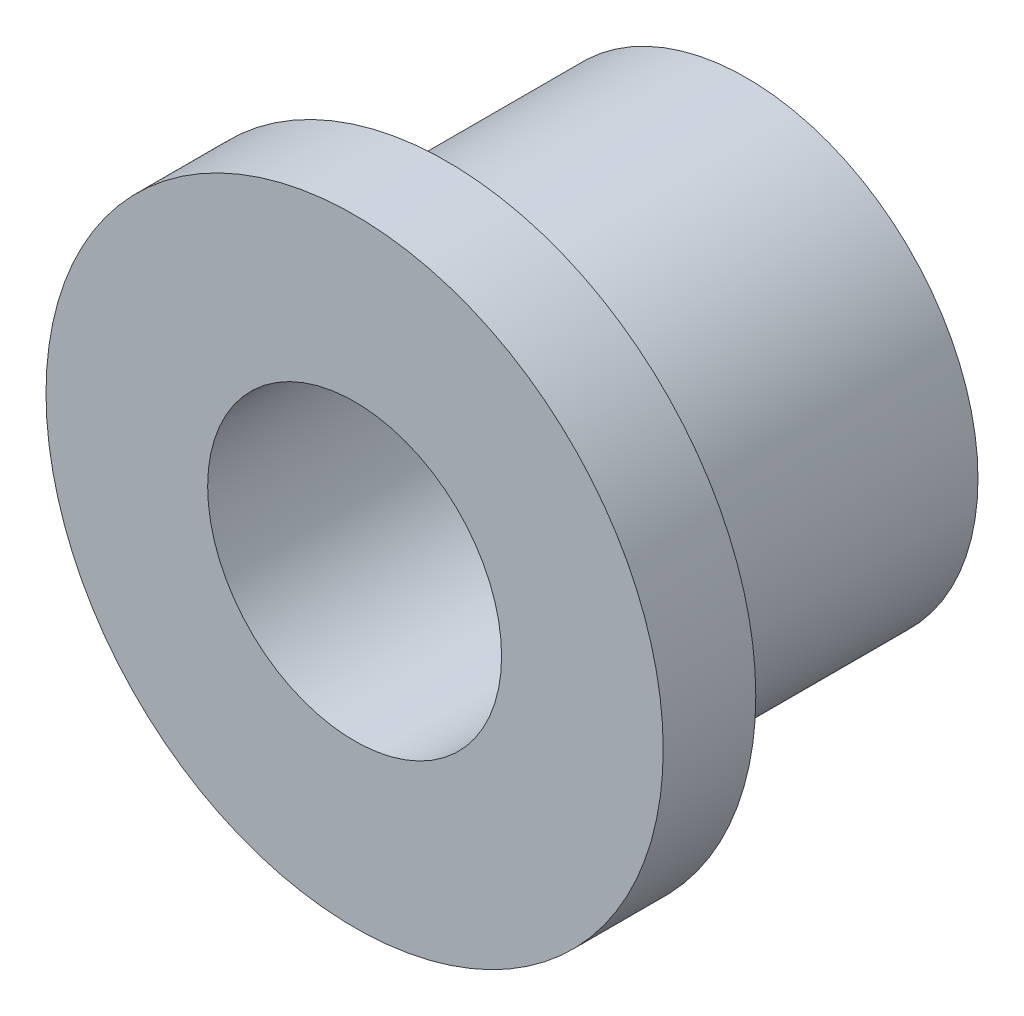
ISO-10303-21;
HEADER;
FILE_DESCRIPTION(('STEP AP214'),'2;1');
FILE_NAME('part.step','',(''),(''),'','','');
FILE_SCHEMA(('AUTOMOTIVE_DESIGN { 1 0 10303 214 1 1 1 1 }'));
ENDSEC;
DATA;
#1=APPLICATION_CONTEXT('core data for automotive mechanical design processes');
#2=APPLICATION_PROTOCOL_DEFINITION('international standard','automotive_design',2000,#1);
#3=PRODUCT_CONTEXT('',#1,'mechanical');
#4=PRODUCT('Part','Part','',(#3));
#5=PRODUCT_RELATED_PRODUCT_CATEGORY('part','',(#4));
#6=PRODUCT_DEFINITION_FORMATION('','',#4);
#7=PRODUCT_DEFINITION_CONTEXT('part definition',#1,'design');
#8=PRODUCT_DEFINITION('design','',#6,#7);
#9=PRODUCT_DEFINITION_SHAPE('','',#8);
#10=(LENGTH_UNIT() NAMED_UNIT(*) SI_UNIT(.MILLI.,.METRE.));
#11=(NAMED_UNIT(*) PLANE_ANGLE_UNIT() SI_UNIT($,.RADIAN.));
#12=(NAMED_UNIT(*) SI_UNIT($,.STERADIAN.) SOLID_ANGLE_UNIT());
#13=UNCERTAINTY_MEASURE_WITH_UNIT(LENGTH_MEASURE(1.E-05),#10,'distance_accuracy_value','');
#14=(GEOMETRIC_REPRESENTATION_CONTEXT(3) GLOBAL_UNCERTAINTY_ASSIGNED_CONTEXT((#13)) GLOBAL_UNIT_ASSIGNED_CONTEXT((#10,
#11,#12)) REPRESENTATION_CONTEXT('',''));
#15=CARTESIAN_POINT('',(0.,0.,0.));
#16=DIRECTION('',(0.,0.,1.));
#17=DIRECTION('',(1.,0.,0.));
#18=AXIS2_PLACEMENT_3D('',#15,#16,#17);
#19=CARTESIAN_POINT('',(0.,0.,6.35));
#20=DIRECTION('',(0.,0.,-1.));
#21=DIRECTION('',(-1.,0.,0.));
#22=AXIS2_PLACEMENT_3D('',#19,#20,#21);
#23=CYLINDRICAL_SURFACE('',#22,7.5);
#24=CARTESIAN_POINT('',(0.,0.,-6.35));
#25=DIRECTION('',(0.,0.,1.));
#26=DIRECTION('',(1.,0.,0.));
#27=AXIS2_PLACEMENT_3D('',#24,#25,#26);
#28=CIRCLE('',#27,7.5);
#29=CARTESIAN_POINT('',(7.5,0.,-6.35));
#30=VERTEX_POINT('',#29);
#31=EDGE_CURVE('E34',#30,#30,#28,.T.);
#32=ORIENTED_EDGE('',*,*,#31,.T.);
#33=EDGE_LOOP('',(#32));
#34=FACE_BOUND('',#33,.T.);
#35=CARTESIAN_POINT('',(0.,0.,3.35));
#36=DIRECTION('',(0.,0.,1.));
#37=DIRECTION('',(1.,0.,0.));
#38=AXIS2_PLACEMENT_3D('',#35,#36,#37);
#39=CIRCLE('',#38,7.5);
#40=CARTESIAN_POINT('',(7.5,0.,3.35));
#41=VERTEX_POINT('',#40);
#42=EDGE_CURVE('E10',#41,#41,#39,.T.);
#43=ORIENTED_EDGE('',*,*,#42,.F.);
#44=EDGE_LOOP('',(#43));
#45=FACE_BOUND('',#44,.T.);
#46=ADVANCED_FACE('F31',(#34,#45),#23,.T.);
#47=CARTESIAN_POINT('',(0.,0.,6.35));
#48=DIRECTION('',(0.,0.,1.));
#49=DIRECTION('',(1.,0.,0.));
#50=AXIS2_PLACEMENT_3D('',#47,#48,#49);
#51=PLANE('',#50);
#52=CARTESIAN_POINT('',(0.,0.,6.35));
#53=DIRECTION('',(0.,0.,1.));
#54=DIRECTION('',(1.,0.,0.));
#55=AXIS2_PLACEMENT_3D('',#52,#53,#54);
#56=CIRCLE('',#55,4.7625);
#57=CARTESIAN_POINT('',(4.7625,0.,6.35));
#58=VERTEX_POINT('',#57);
#59=EDGE_CURVE('E47',#58,#58,#56,.T.);
#60=ORIENTED_EDGE('',*,*,#59,.F.);
#61=EDGE_LOOP('',(#60));
#62=FACE_BOUND('',#61,.T.);
#63=CARTESIAN_POINT('',(0.,0.,6.35));
#64=DIRECTION('',(0.,0.,1.));
#65=DIRECTION('',(1.,0.,0.));
#66=AXIS2_PLACEMENT_3D('',#63,#64,#65);
#67=CIRCLE('',#66,10.);
#68=CARTESIAN_POINT('',(10.,0.,6.35));
#69=VERTEX_POINT('',#68);
#70=EDGE_CURVE('E45',#69,#69,#67,.T.);
#71=ORIENTED_EDGE('',*,*,#70,.T.);
#72=EDGE_LOOP('',(#71));
#73=FACE_BOUND('',#72,.T.);
#74=ADVANCED_FACE('F58',(#62,#73),#51,.T.);
#75=CARTESIAN_POINT('',(0.,0.,-6.35));
#76=DIRECTION('',(0.,0.,1.));
#77=DIRECTION('',(1.,0.,0.));
#78=AXIS2_PLACEMENT_3D('',#75,#76,#77);
#79=PLANE('',#78);
#80=CARTESIAN_POINT('',(0.,0.,-6.35));
#81=DIRECTION('',(0.,0.,1.));
#82=DIRECTION('',(1.,0.,0.));
#83=AXIS2_PLACEMENT_3D('',#80,#81,#82);
#84=CIRCLE('',#83,4.7625);
#85=CARTESIAN_POINT('',(4.7625,0.,-6.35));
#86=VERTEX_POINT('',#85);
#87=EDGE_CURVE('E42',#86,#86,#84,.F.);
#88=ORIENTED_EDGE('',*,*,#87,.F.);
#89=EDGE_LOOP('',(#88));
#90=FACE_BOUND('',#89,.T.);
#91=ORIENTED_EDGE('',*,*,#31,.F.);
#92=EDGE_LOOP('',(#91));
#93=FACE_BOUND('',#92,.T.);
#94=ADVANCED_FACE('F55',(#90,#93),#79,.F.);
#95=CARTESIAN_POINT('',(0.,0.,-19.8203841816037));
#96=DIRECTION('',(0.,0.,1.));
#97=DIRECTION('',(1.,0.,0.));
#98=AXIS2_PLACEMENT_3D('',#95,#96,#97);
#99=CYLINDRICAL_SURFACE('',#98,4.7625);
#100=ORIENTED_EDGE('',*,*,#59,.T.);
#101=EDGE_LOOP('',(#100));
#102=FACE_BOUND('',#101,.T.);
#103=ORIENTED_EDGE('',*,*,#87,.T.);
#104=EDGE_LOOP('',(#103));
#105=FACE_BOUND('',#104,.T.);
#106=ADVANCED_FACE('F53',(#102,#105),#99,.F.);
#107=CARTESIAN_POINT('',(0.,0.,3.35));
#108=DIRECTION('',(0.,0.,1.));
#109=DIRECTION('',(1.,0.,0.));
#110=AXIS2_PLACEMENT_3D('',#107,#108,#109);
#111=PLANE('',#110);
#112=CARTESIAN_POINT('',(0.,0.,3.35));
#113=DIRECTION('',(0.,0.,1.));
#114=DIRECTION('',(1.,0.,0.));
#115=AXIS2_PLACEMENT_3D('',#112,#113,#114);
#116=CIRCLE('',#115,10.);
#117=CARTESIAN_POINT('',(10.,0.,3.35));
#118=VERTEX_POINT('',#117);
#119=EDGE_CURVE('E49',#118,#118,#116,.T.);
#120=ORIENTED_EDGE('',*,*,#119,.F.);
#121=EDGE_LOOP('',(#120));
#122=FACE_BOUND('',#121,.T.);
#123=ORIENTED_EDGE('',*,*,#42,.T.);
#124=EDGE_LOOP('',(#123));
#125=FACE_BOUND('',#124,.T.);
#126=ADVANCED_FACE('F75',(#122,#125),#111,.F.);
#127=CARTESIAN_POINT('',(0.,0.,3.35));
#128=DIRECTION('',(0.,0.,1.));
#129=DIRECTION('',(1.,0.,0.));
#130=AXIS2_PLACEMENT_3D('',#127,#128,#129);
#131=CYLINDRICAL_SURFACE('',#130,10.);
#132=ORIENTED_EDGE('',*,*,#119,.T.);
#133=EDGE_LOOP('',(#132));
#134=FACE_BOUND('',#133,.T.);
#135=ORIENTED_EDGE('',*,*,#70,.F.);
#136=EDGE_LOOP('',(#135));
#137=FACE_BOUND('',#136,.T.);
#138=ADVANCED_FACE('F77',(#134,#137),#131,.T.);
#139=CLOSED_SHELL('',(#46,#74,#94,#106,#126,#138));
#140=MANIFOLD_SOLID_BREP('B2',#139);
#141=ADVANCED_BREP_SHAPE_REPRESENTATION('',(#18,#140),#14);
#142=SHAPE_DEFINITION_REPRESENTATION(#9,#141);
ENDSEC;
END-ISO-10303-21;
